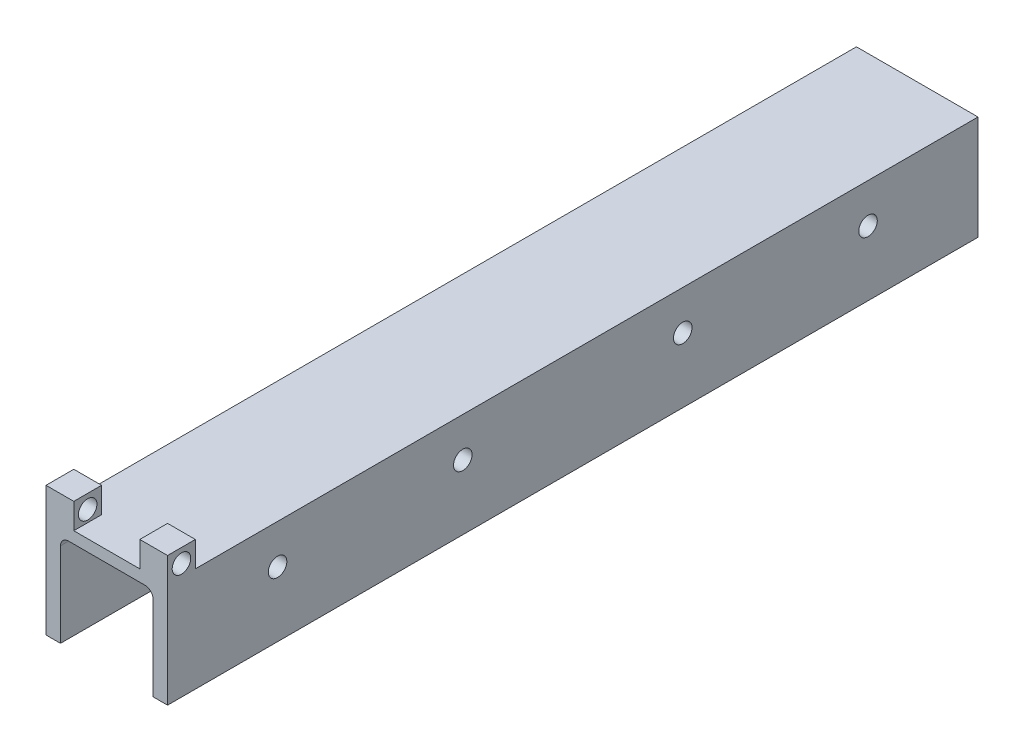
ISO-10303-21;
HEADER;
FILE_DESCRIPTION(('STEP AP214'),'2;1');
FILE_NAME('part.step','',(''),(''),'','','');
FILE_SCHEMA(('AUTOMOTIVE_DESIGN { 1 0 10303 214 1 1 1 1 }'));
ENDSEC;
DATA;
#1=APPLICATION_CONTEXT('core data for automotive mechanical design processes');
#2=APPLICATION_PROTOCOL_DEFINITION('international standard','automotive_design',2000,#1);
#3=PRODUCT_CONTEXT('',#1,'mechanical');
#4=PRODUCT('Part','Part','',(#3));
#5=PRODUCT_RELATED_PRODUCT_CATEGORY('part','',(#4));
#6=PRODUCT_DEFINITION_FORMATION('','',#4);
#7=PRODUCT_DEFINITION_CONTEXT('part definition',#1,'design');
#8=PRODUCT_DEFINITION('design','',#6,#7);
#9=PRODUCT_DEFINITION_SHAPE('','',#8);
#10=(LENGTH_UNIT() NAMED_UNIT(*) SI_UNIT(.MILLI.,.METRE.));
#11=(NAMED_UNIT(*) PLANE_ANGLE_UNIT() SI_UNIT($,.RADIAN.));
#12=(NAMED_UNIT(*) SI_UNIT($,.STERADIAN.) SOLID_ANGLE_UNIT());
#13=UNCERTAINTY_MEASURE_WITH_UNIT(LENGTH_MEASURE(1.E-05),#10,'distance_accuracy_value','');
#14=(GEOMETRIC_REPRESENTATION_CONTEXT(3) GLOBAL_UNCERTAINTY_ASSIGNED_CONTEXT((#13)) GLOBAL_UNIT_ASSIGNED_CONTEXT((#10,
#11,#12)) REPRESENTATION_CONTEXT('',''));
#15=CARTESIAN_POINT('',(0.,0.,0.));
#16=DIRECTION('',(0.,0.,1.));
#17=DIRECTION('',(1.,0.,0.));
#18=AXIS2_PLACEMENT_3D('',#15,#16,#17);
#19=CARTESIAN_POINT('',(0.,0.,-177.8));
#20=DIRECTION('',(0.,-1.,0.));
#21=DIRECTION('',(0.,0.,-1.));
#22=AXIS2_PLACEMENT_3D('',#19,#20,#21);
#23=PLANE('',#22);
#24=DIRECTION('',(1.,0.,0.));
#25=VECTOR('',#24,1.);
#26=CARTESIAN_POINT('',(0.,0.,0.));
#27=LINE('',#26,#25);
#28=CARTESIAN_POINT('',(0.,0.,0.));
#29=VERTEX_POINT('',#28);
#30=CARTESIAN_POINT('',(3.175,0.,0.));
#31=VERTEX_POINT('',#30);
#32=EDGE_CURVE('E277',#29,#31,#27,.T.);
#33=ORIENTED_EDGE('',*,*,#32,.F.);
#34=DIRECTION('',(0.,0.,1.));
#35=VECTOR('',#34,1.);
#36=CARTESIAN_POINT('',(0.,0.,-177.8));
#37=LINE('',#36,#35);
#38=CARTESIAN_POINT('',(0.,0.,-177.8));
#39=VERTEX_POINT('',#38);
#40=EDGE_CURVE('E11',#39,#29,#37,.T.);
#41=ORIENTED_EDGE('',*,*,#40,.F.);
#42=DIRECTION('',(1.,0.,0.));
#43=VECTOR('',#42,1.);
#44=CARTESIAN_POINT('',(0.,0.,-177.8));
#45=LINE('',#44,#43);
#46=CARTESIAN_POINT('',(3.175,0.,-177.8));
#47=VERTEX_POINT('',#46);
#48=EDGE_CURVE('E278',#39,#47,#45,.T.);
#49=ORIENTED_EDGE('',*,*,#48,.T.);
#50=DIRECTION('',(0.,0.,1.));
#51=VECTOR('',#50,1.);
#52=CARTESIAN_POINT('',(3.175,0.,-177.8));
#53=LINE('',#52,#51);
#54=EDGE_CURVE('E317',#47,#31,#53,.T.);
#55=ORIENTED_EDGE('',*,*,#54,.T.);
#56=EDGE_LOOP('',(#33,#41,#49,#55));
#57=FACE_BOUND('',#56,.T.);
#58=ADVANCED_FACE('F47',(#57),#23,.T.);
#59=CARTESIAN_POINT('',(0.,0.,-177.8));
#60=DIRECTION('',(-1.,0.,0.));
#61=DIRECTION('',(0.,0.,1.));
#62=AXIS2_PLACEMENT_3D('',#59,#60,#61);
#63=PLANE('',#62);
#64=CARTESIAN_POINT('',(0.,25.4,-3.048));
#65=DIRECTION('',(-1.,0.,0.));
#66=DIRECTION('',(0.,0.,1.));
#67=AXIS2_PLACEMENT_3D('',#64,#65,#66);
#68=CIRCLE('',#67,2.032);
#69=CARTESIAN_POINT('',(0.,25.4,-1.016));
#70=VERTEX_POINT('',#69);
#71=EDGE_CURVE('E741',#70,#70,#68,.T.);
#72=ORIENTED_EDGE('',*,*,#71,.F.);
#73=EDGE_LOOP('',(#72));
#74=FACE_BOUND('',#73,.T.);
#75=CARTESIAN_POINT('',(0.,14.224,-24.13));
#76=DIRECTION('',(1.,0.,0.));
#77=DIRECTION('',(0.,0.,-1.));
#78=AXIS2_PLACEMENT_3D('',#75,#76,#77);
#79=CIRCLE('',#78,2.032);
#80=CARTESIAN_POINT('',(0.,14.224,-26.162));
#81=VERTEX_POINT('',#80);
#82=EDGE_CURVE('E235',#81,#81,#79,.T.);
#83=ORIENTED_EDGE('',*,*,#82,.T.);
#84=EDGE_LOOP('',(#83));
#85=FACE_BOUND('',#84,.T.);
#86=CARTESIAN_POINT('',(0.,14.224,-64.77));
#87=DIRECTION('',(1.,0.,0.));
#88=DIRECTION('',(0.,0.,-1.));
#89=AXIS2_PLACEMENT_3D('',#86,#87,#88);
#90=CIRCLE('',#89,2.03200000000001);
#91=CARTESIAN_POINT('',(0.,14.224,-66.802));
#92=VERTEX_POINT('',#91);
#93=EDGE_CURVE('E239',#92,#92,#90,.T.);
#94=ORIENTED_EDGE('',*,*,#93,.T.);
#95=EDGE_LOOP('',(#94));
#96=FACE_BOUND('',#95,.T.);
#97=CARTESIAN_POINT('',(0.,14.224,-113.03));
#98=DIRECTION('',(1.,0.,0.));
#99=DIRECTION('',(0.,0.,1.));
#100=AXIS2_PLACEMENT_3D('',#97,#98,#99);
#101=CIRCLE('',#100,2.03200000000001);
#102=CARTESIAN_POINT('',(0.,14.224,-110.998));
#103=VERTEX_POINT('',#102);
#104=EDGE_CURVE('E247',#103,#103,#101,.T.);
#105=ORIENTED_EDGE('',*,*,#104,.T.);
#106=EDGE_LOOP('',(#105));
#107=FACE_BOUND('',#106,.T.);
#108=CARTESIAN_POINT('',(0.,14.224,-153.67));
#109=DIRECTION('',(1.,0.,0.));
#110=DIRECTION('',(0.,0.,1.));
#111=AXIS2_PLACEMENT_3D('',#108,#109,#110);
#112=CIRCLE('',#111,2.03200000000001);
#113=CARTESIAN_POINT('',(0.,14.224,-151.638));
#114=VERTEX_POINT('',#113);
#115=EDGE_CURVE('E191',#114,#114,#112,.T.);
#116=ORIENTED_EDGE('',*,*,#115,.T.);
#117=EDGE_LOOP('',(#116));
#118=FACE_BOUND('',#117,.T.);
#119=DIRECTION('',(0.,-1.,0.));
#120=VECTOR('',#119,1.);
#121=CARTESIAN_POINT('',(0.,0.,0.));
#122=LINE('',#121,#120);
#123=CARTESIAN_POINT('',(0.,28.448,0.));
#124=VERTEX_POINT('',#123);
#125=EDGE_CURVE('E283',#124,#29,#122,.T.);
#126=ORIENTED_EDGE('',*,*,#125,.F.);
#127=DIRECTION('',(0.,0.,1.));
#128=VECTOR('',#127,1.);
#129=CARTESIAN_POINT('',(0.,28.448,0.));
#130=LINE('',#129,#128);
#131=CARTESIAN_POINT('',(0.,28.448,-6.096));
#132=VERTEX_POINT('',#131);
#133=EDGE_CURVE('E215',#132,#124,#130,.T.);
#134=ORIENTED_EDGE('',*,*,#133,.F.);
#135=DIRECTION('',(0.,-1.,0.));
#136=VECTOR('',#135,1.);
#137=CARTESIAN_POINT('',(0.,28.448,-6.096));
#138=LINE('',#137,#136);
#139=CARTESIAN_POINT('',(0.,22.86,-6.09599999999999));
#140=VERTEX_POINT('',#139);
#141=EDGE_CURVE('E206',#132,#140,#138,.T.);
#142=ORIENTED_EDGE('',*,*,#141,.T.);
#143=DIRECTION('',(0.,0.,1.));
#144=VECTOR('',#143,1.);
#145=CARTESIAN_POINT('',(0.,22.86,-177.8));
#146=LINE('',#145,#144);
#147=CARTESIAN_POINT('',(0.,22.86,-177.8));
#148=VERTEX_POINT('',#147);
#149=EDGE_CURVE('E56',#148,#140,#146,.T.);
#150=ORIENTED_EDGE('',*,*,#149,.F.);
#151=DIRECTION('',(0.,-1.,0.));
#152=VECTOR('',#151,1.);
#153=CARTESIAN_POINT('',(0.,0.,-177.8));
#154=LINE('',#153,#152);
#155=EDGE_CURVE('E313',#148,#39,#154,.T.);
#156=ORIENTED_EDGE('',*,*,#155,.T.);
#157=ORIENTED_EDGE('',*,*,#40,.T.);
#158=EDGE_LOOP('',(#126,#134,#142,#150,#156,#157));
#159=FACE_BOUND('',#158,.T.);
#160=ADVANCED_FACE('F403',(#74,#85,#96,#107,#118,#159),#63,.T.);
#161=CARTESIAN_POINT('',(0.,22.86,-177.8));
#162=DIRECTION('',(0.,1.,0.));
#163=DIRECTION('',(0.,0.,1.));
#164=AXIS2_PLACEMENT_3D('',#161,#162,#163);
#165=PLANE('',#164);
#166=DIRECTION('',(0.,0.,1.));
#167=VECTOR('',#166,1.);
#168=CARTESIAN_POINT('',(20.574,22.86,0.));
#169=LINE('',#168,#167);
#170=CARTESIAN_POINT('',(20.574,22.86,-6.096));
#171=VERTEX_POINT('',#170);
#172=CARTESIAN_POINT('',(20.574,22.86,0.));
#173=VERTEX_POINT('',#172);
#174=EDGE_CURVE('E180',#171,#173,#169,.T.);
#175=ORIENTED_EDGE('',*,*,#174,.F.);
#176=DIRECTION('',(-1.,0.,0.));
#177=VECTOR('',#176,1.);
#178=CARTESIAN_POINT('',(26.67,22.86,-6.096));
#179=LINE('',#178,#177);
#180=CARTESIAN_POINT('',(26.67,22.86,-6.09599999999999));
#181=VERTEX_POINT('',#180);
#182=EDGE_CURVE('E70',#181,#171,#179,.T.);
#183=ORIENTED_EDGE('',*,*,#182,.F.);
#184=DIRECTION('',(0.,0.,1.));
#185=VECTOR('',#184,1.);
#186=CARTESIAN_POINT('',(26.67,22.86,-177.8));
#187=LINE('',#186,#185);
#188=CARTESIAN_POINT('',(26.67,22.86,-177.8));
#189=VERTEX_POINT('',#188);
#190=EDGE_CURVE('E184',#189,#181,#187,.T.);
#191=ORIENTED_EDGE('',*,*,#190,.F.);
#192=DIRECTION('',(-1.,0.,0.));
#193=VECTOR('',#192,1.);
#194=CARTESIAN_POINT('',(0.,22.86,-177.8));
#195=LINE('',#194,#193);
#196=EDGE_CURVE('E310',#189,#148,#195,.T.);
#197=ORIENTED_EDGE('',*,*,#196,.T.);
#198=ORIENTED_EDGE('',*,*,#149,.T.);
#199=DIRECTION('',(-1.,0.,0.));
#200=VECTOR('',#199,1.);
#201=CARTESIAN_POINT('',(0.,22.86,-6.096));
#202=LINE('',#201,#200);
#203=CARTESIAN_POINT('',(6.096,22.86,-6.096));
#204=VERTEX_POINT('',#203);
#205=EDGE_CURVE('E211',#204,#140,#202,.T.);
#206=ORIENTED_EDGE('',*,*,#205,.F.);
#207=DIRECTION('',(0.,0.,-1.));
#208=VECTOR('',#207,1.);
#209=CARTESIAN_POINT('',(6.096,22.86,0.));
#210=LINE('',#209,#208);
#211=CARTESIAN_POINT('',(6.096,22.86,0.));
#212=VERTEX_POINT('',#211);
#213=EDGE_CURVE('E214',#212,#204,#210,.T.);
#214=ORIENTED_EDGE('',*,*,#213,.F.);
#215=DIRECTION('',(-1.,0.,0.));
#216=VECTOR('',#215,1.);
#217=CARTESIAN_POINT('',(0.,22.86,0.));
#218=LINE('',#217,#216);
#219=EDGE_CURVE('E348',#173,#212,#218,.T.);
#220=ORIENTED_EDGE('',*,*,#219,.F.);
#221=EDGE_LOOP('',(#175,#183,#191,#197,#198,#206,#214,#220));
#222=FACE_BOUND('',#221,.T.);
#223=ADVANCED_FACE('F406',(#222),#165,.T.);
#224=CARTESIAN_POINT('',(26.67,0.,-177.8));
#225=DIRECTION('',(1.,0.,0.));
#226=DIRECTION('',(0.,0.,-1.));
#227=AXIS2_PLACEMENT_3D('',#224,#225,#226);
#228=PLANE('',#227);
#229=CARTESIAN_POINT('',(26.67,25.4,-3.048));
#230=DIRECTION('',(-1.,0.,0.));
#231=DIRECTION('',(0.,0.,1.));
#232=AXIS2_PLACEMENT_3D('',#229,#230,#231);
#233=CIRCLE('',#232,2.032);
#234=CARTESIAN_POINT('',(26.67,25.4,-1.016));
#235=VERTEX_POINT('',#234);
#236=EDGE_CURVE('E747',#235,#235,#233,.T.);
#237=ORIENTED_EDGE('',*,*,#236,.T.);
#238=EDGE_LOOP('',(#237));
#239=FACE_BOUND('',#238,.T.);
#240=CARTESIAN_POINT('',(26.67,14.224,-24.13));
#241=DIRECTION('',(1.,0.,0.));
#242=DIRECTION('',(0.,0.,-1.));
#243=AXIS2_PLACEMENT_3D('',#240,#241,#242);
#244=CIRCLE('',#243,2.032);
#245=CARTESIAN_POINT('',(26.67,14.224,-26.162));
#246=VERTEX_POINT('',#245);
#247=EDGE_CURVE('E230',#246,#246,#244,.T.);
#248=ORIENTED_EDGE('',*,*,#247,.F.);
#249=EDGE_LOOP('',(#248));
#250=FACE_BOUND('',#249,.T.);
#251=CARTESIAN_POINT('',(26.67,14.224,-64.77));
#252=DIRECTION('',(1.,0.,0.));
#253=DIRECTION('',(0.,0.,-1.));
#254=AXIS2_PLACEMENT_3D('',#251,#252,#253);
#255=CIRCLE('',#254,2.03200000000001);
#256=CARTESIAN_POINT('',(26.67,14.224,-66.802));
#257=VERTEX_POINT('',#256);
#258=EDGE_CURVE('E243',#257,#257,#255,.T.);
#259=ORIENTED_EDGE('',*,*,#258,.F.);
#260=EDGE_LOOP('',(#259));
#261=FACE_BOUND('',#260,.T.);
#262=CARTESIAN_POINT('',(26.67,14.224,-113.03));
#263=DIRECTION('',(1.,0.,0.));
#264=DIRECTION('',(0.,0.,1.));
#265=AXIS2_PLACEMENT_3D('',#262,#263,#264);
#266=CIRCLE('',#265,2.03200000000001);
#267=CARTESIAN_POINT('',(26.67,14.224,-110.998));
#268=VERTEX_POINT('',#267);
#269=EDGE_CURVE('E251',#268,#268,#266,.T.);
#270=ORIENTED_EDGE('',*,*,#269,.F.);
#271=EDGE_LOOP('',(#270));
#272=FACE_BOUND('',#271,.T.);
#273=CARTESIAN_POINT('',(26.67,14.224,-153.67));
#274=DIRECTION('',(1.,0.,0.));
#275=DIRECTION('',(0.,0.,1.));
#276=AXIS2_PLACEMENT_3D('',#273,#274,#275);
#277=CIRCLE('',#276,2.03200000000001);
#278=CARTESIAN_POINT('',(26.67,14.224,-151.638));
#279=VERTEX_POINT('',#278);
#280=EDGE_CURVE('E186',#279,#279,#277,.T.);
#281=ORIENTED_EDGE('',*,*,#280,.F.);
#282=EDGE_LOOP('',(#281));
#283=FACE_BOUND('',#282,.T.);
#284=DIRECTION('',(0.,1.,0.));
#285=VECTOR('',#284,1.);
#286=CARTESIAN_POINT('',(26.67,0.,0.));
#287=LINE('',#286,#285);
#288=CARTESIAN_POINT('',(26.67,0.,0.));
#289=VERTEX_POINT('',#288);
#290=CARTESIAN_POINT('',(26.67,28.448,0.));
#291=VERTEX_POINT('',#290);
#292=EDGE_CURVE('E345',#289,#291,#287,.T.);
#293=ORIENTED_EDGE('',*,*,#292,.F.);
#294=DIRECTION('',(0.,0.,1.));
#295=VECTOR('',#294,1.);
#296=CARTESIAN_POINT('',(26.67,0.,-177.8));
#297=LINE('',#296,#295);
#298=CARTESIAN_POINT('',(26.67,0.,-177.8));
#299=VERTEX_POINT('',#298);
#300=EDGE_CURVE('E359',#299,#289,#297,.T.);
#301=ORIENTED_EDGE('',*,*,#300,.F.);
#302=DIRECTION('',(0.,1.,0.));
#303=VECTOR('',#302,1.);
#304=CARTESIAN_POINT('',(26.67,0.,-177.8));
#305=LINE('',#304,#303);
#306=EDGE_CURVE('E307',#299,#189,#305,.T.);
#307=ORIENTED_EDGE('',*,*,#306,.T.);
#308=ORIENTED_EDGE('',*,*,#190,.T.);
#309=DIRECTION('',(0.,-1.,0.));
#310=VECTOR('',#309,1.);
#311=CARTESIAN_POINT('',(26.67,28.448,-6.096));
#312=LINE('',#311,#310);
#313=CARTESIAN_POINT('',(26.67,28.448,-6.096));
#314=VERTEX_POINT('',#313);
#315=EDGE_CURVE('E163',#314,#181,#312,.T.);
#316=ORIENTED_EDGE('',*,*,#315,.F.);
#317=DIRECTION('',(0.,0.,-1.));
#318=VECTOR('',#317,1.);
#319=CARTESIAN_POINT('',(26.67,28.448,0.));
#320=LINE('',#319,#318);
#321=EDGE_CURVE('E170',#291,#314,#320,.T.);
#322=ORIENTED_EDGE('',*,*,#321,.F.);
#323=EDGE_LOOP('',(#293,#301,#307,#308,#316,#322));
#324=FACE_BOUND('',#323,.T.);
#325=ADVANCED_FACE('F182',(#239,#250,#261,#272,#283,#324),#228,.T.);
#326=CARTESIAN_POINT('',(23.495,0.,-177.8));
#327=DIRECTION('',(0.,-1.,0.));
#328=DIRECTION('',(0.,0.,-1.));
#329=AXIS2_PLACEMENT_3D('',#326,#327,#328);
#330=PLANE('',#329);
#331=DIRECTION('',(1.,0.,0.));
#332=VECTOR('',#331,1.);
#333=CARTESIAN_POINT('',(23.495,0.,0.));
#334=LINE('',#333,#332);
#335=CARTESIAN_POINT('',(23.495,0.,0.));
#336=VERTEX_POINT('',#335);
#337=EDGE_CURVE('E341',#336,#289,#334,.T.);
#338=ORIENTED_EDGE('',*,*,#337,.F.);
#339=DIRECTION('',(0.,0.,1.));
#340=VECTOR('',#339,1.);
#341=CARTESIAN_POINT('',(23.495,0.,-177.8));
#342=LINE('',#341,#340);
#343=CARTESIAN_POINT('',(23.495,0.,-177.8));
#344=VERTEX_POINT('',#343);
#345=EDGE_CURVE('E362',#344,#336,#342,.T.);
#346=ORIENTED_EDGE('',*,*,#345,.F.);
#347=DIRECTION('',(1.,0.,0.));
#348=VECTOR('',#347,1.);
#349=CARTESIAN_POINT('',(23.495,0.,-177.8));
#350=LINE('',#349,#348);
#351=EDGE_CURVE('E303',#344,#299,#350,.T.);
#352=ORIENTED_EDGE('',*,*,#351,.T.);
#353=ORIENTED_EDGE('',*,*,#300,.T.);
#354=EDGE_LOOP('',(#338,#346,#352,#353));
#355=FACE_BOUND('',#354,.T.);
#356=ADVANCED_FACE('F458',(#355),#330,.T.);
#357=CARTESIAN_POINT('',(23.495,18.542,-177.8));
#358=DIRECTION('',(-1.,0.,0.));
#359=DIRECTION('',(0.,0.,1.));
#360=AXIS2_PLACEMENT_3D('',#357,#358,#359);
#361=PLANE('',#360);
#362=CARTESIAN_POINT('',(23.495,14.224,-24.13));
#363=DIRECTION('',(-1.,0.,0.));
#364=DIRECTION('',(0.,0.,1.));
#365=AXIS2_PLACEMENT_3D('',#362,#363,#364);
#366=CIRCLE('',#365,2.032);
#367=CARTESIAN_POINT('',(23.495,14.224,-22.098));
#368=VERTEX_POINT('',#367);
#369=EDGE_CURVE('E273',#368,#368,#366,.F.);
#370=ORIENTED_EDGE('',*,*,#369,.T.);
#371=EDGE_LOOP('',(#370));
#372=FACE_BOUND('',#371,.T.);
#373=CARTESIAN_POINT('',(23.495,14.224,-64.77));
#374=DIRECTION('',(-1.,0.,0.));
#375=DIRECTION('',(0.,0.,1.));
#376=AXIS2_PLACEMENT_3D('',#373,#374,#375);
#377=CIRCLE('',#376,2.03200000000001);
#378=CARTESIAN_POINT('',(23.495,14.224,-62.738));
#379=VERTEX_POINT('',#378);
#380=EDGE_CURVE('E268',#379,#379,#377,.F.);
#381=ORIENTED_EDGE('',*,*,#380,.T.);
#382=EDGE_LOOP('',(#381));
#383=FACE_BOUND('',#382,.T.);
#384=CARTESIAN_POINT('',(23.495,14.224,-113.03));
#385=DIRECTION('',(-1.,0.,0.));
#386=DIRECTION('',(0.,0.,1.));
#387=AXIS2_PLACEMENT_3D('',#384,#385,#386);
#388=CIRCLE('',#387,2.03200000000001);
#389=CARTESIAN_POINT('',(23.495,14.224,-110.998));
#390=VERTEX_POINT('',#389);
#391=EDGE_CURVE('E263',#390,#390,#388,.F.);
#392=ORIENTED_EDGE('',*,*,#391,.T.);
#393=EDGE_LOOP('',(#392));
#394=FACE_BOUND('',#393,.T.);
#395=CARTESIAN_POINT('',(23.495,14.224,-153.67));
#396=DIRECTION('',(-1.,0.,0.));
#397=DIRECTION('',(0.,0.,1.));
#398=AXIS2_PLACEMENT_3D('',#395,#396,#397);
#399=CIRCLE('',#398,2.03200000000001);
#400=CARTESIAN_POINT('',(23.495,14.224,-151.638));
#401=VERTEX_POINT('',#400);
#402=EDGE_CURVE('E258',#401,#401,#399,.F.);
#403=ORIENTED_EDGE('',*,*,#402,.T.);
#404=EDGE_LOOP('',(#403));
#405=FACE_BOUND('',#404,.T.);
#406=DIRECTION('',(0.,-1.,0.));
#407=VECTOR('',#406,1.);
#408=CARTESIAN_POINT('',(23.495,18.542,0.));
#409=LINE('',#408,#407);
#410=CARTESIAN_POINT('',(23.495,18.542,0.));
#411=VERTEX_POINT('',#410);
#412=EDGE_CURVE('E337',#411,#336,#409,.T.);
#413=ORIENTED_EDGE('',*,*,#412,.F.);
#414=DIRECTION('',(0.,0.,1.));
#415=VECTOR('',#414,1.);
#416=CARTESIAN_POINT('',(23.495,18.542,-177.8));
#417=LINE('',#416,#415);
#418=CARTESIAN_POINT('',(23.495,18.542,-177.8));
#419=VERTEX_POINT('',#418);
#420=EDGE_CURVE('E365',#419,#411,#417,.T.);
#421=ORIENTED_EDGE('',*,*,#420,.F.);
#422=DIRECTION('',(0.,-1.,0.));
#423=VECTOR('',#422,1.);
#424=CARTESIAN_POINT('',(23.495,18.542,-177.8));
#425=LINE('',#424,#423);
#426=EDGE_CURVE('E299',#419,#344,#425,.T.);
#427=ORIENTED_EDGE('',*,*,#426,.T.);
#428=ORIENTED_EDGE('',*,*,#345,.T.);
#429=EDGE_LOOP('',(#413,#421,#427,#428));
#430=FACE_BOUND('',#429,.T.);
#431=ADVANCED_FACE('F454',(#372,#383,#394,#405,#430),#361,.T.);
#432=CARTESIAN_POINT('',(21.717,18.542,-177.8));
#433=DIRECTION('',(0.,0.,1.));
#434=DIRECTION('',(1.,0.,0.));
#435=AXIS2_PLACEMENT_3D('',#432,#433,#434);
#436=CYLINDRICAL_SURFACE('',#435,1.778);
#437=CARTESIAN_POINT('',(21.717,18.542,0.));
#438=DIRECTION('',(0.,0.,-1.));
#439=DIRECTION('',(1.,0.,0.));
#440=AXIS2_PLACEMENT_3D('',#437,#438,#439);
#441=CIRCLE('',#440,1.778);
#442=CARTESIAN_POINT('',(21.717,20.32,0.));
#443=VERTEX_POINT('',#442);
#444=EDGE_CURVE('E333',#443,#411,#441,.T.);
#445=ORIENTED_EDGE('',*,*,#444,.F.);
#446=DIRECTION('',(0.,0.,1.));
#447=VECTOR('',#446,1.);
#448=CARTESIAN_POINT('',(21.717,20.32,-177.8));
#449=LINE('',#448,#447);
#450=CARTESIAN_POINT('',(21.717,20.32,-177.8));
#451=VERTEX_POINT('',#450);
#452=EDGE_CURVE('E368',#451,#443,#449,.T.);
#453=ORIENTED_EDGE('',*,*,#452,.F.);
#454=CARTESIAN_POINT('',(21.717,18.542,-177.8));
#455=DIRECTION('',(0.,0.,-1.));
#456=DIRECTION('',(1.,0.,0.));
#457=AXIS2_PLACEMENT_3D('',#454,#455,#456);
#458=CIRCLE('',#457,1.778);
#459=EDGE_CURVE('E295',#451,#419,#458,.T.);
#460=ORIENTED_EDGE('',*,*,#459,.T.);
#461=ORIENTED_EDGE('',*,*,#420,.T.);
#462=EDGE_LOOP('',(#445,#453,#460,#461));
#463=FACE_BOUND('',#462,.T.);
#464=ADVANCED_FACE('F450',(#463),#436,.F.);
#465=CARTESIAN_POINT('',(4.95300000000001,20.32,-177.8));
#466=DIRECTION('',(0.,-1.,0.));
#467=DIRECTION('',(0.,0.,-1.));
#468=AXIS2_PLACEMENT_3D('',#465,#466,#467);
#469=PLANE('',#468);
#470=DIRECTION('',(1.,0.,0.));
#471=VECTOR('',#470,1.);
#472=CARTESIAN_POINT('',(4.95300000000001,20.32,0.));
#473=LINE('',#472,#471);
#474=CARTESIAN_POINT('',(4.95300000000001,20.32,0.));
#475=VERTEX_POINT('',#474);
#476=EDGE_CURVE('E329',#475,#443,#473,.T.);
#477=ORIENTED_EDGE('',*,*,#476,.F.);
#478=DIRECTION('',(0.,0.,1.));
#479=VECTOR('',#478,1.);
#480=CARTESIAN_POINT('',(4.95300000000001,20.32,-177.8));
#481=LINE('',#480,#479);
#482=CARTESIAN_POINT('',(4.95300000000001,20.32,-177.8));
#483=VERTEX_POINT('',#482);
#484=EDGE_CURVE('E371',#483,#475,#481,.T.);
#485=ORIENTED_EDGE('',*,*,#484,.F.);
#486=DIRECTION('',(1.,0.,0.));
#487=VECTOR('',#486,1.);
#488=CARTESIAN_POINT('',(4.95300000000001,20.32,-177.8));
#489=LINE('',#488,#487);
#490=EDGE_CURVE('E291',#483,#451,#489,.T.);
#491=ORIENTED_EDGE('',*,*,#490,.T.);
#492=ORIENTED_EDGE('',*,*,#452,.T.);
#493=EDGE_LOOP('',(#477,#485,#491,#492));
#494=FACE_BOUND('',#493,.T.);
#495=ADVANCED_FACE('F446',(#494),#469,.T.);
#496=CARTESIAN_POINT('',(4.953,18.542,-177.8));
#497=DIRECTION('',(0.,0.,1.));
#498=DIRECTION('',(1.,0.,0.));
#499=AXIS2_PLACEMENT_3D('',#496,#497,#498);
#500=CYLINDRICAL_SURFACE('',#499,1.778);
#501=CARTESIAN_POINT('',(4.953,18.542,0.));
#502=DIRECTION('',(0.,0.,-1.));
#503=DIRECTION('',(-1.,0.,0.));
#504=AXIS2_PLACEMENT_3D('',#501,#502,#503);
#505=CIRCLE('',#504,1.778);
#506=CARTESIAN_POINT('',(3.175,18.542,0.));
#507=VERTEX_POINT('',#506);
#508=EDGE_CURVE('E325',#507,#475,#505,.T.);
#509=ORIENTED_EDGE('',*,*,#508,.F.);
#510=DIRECTION('',(0.,0.,1.));
#511=VECTOR('',#510,1.);
#512=CARTESIAN_POINT('',(3.175,18.542,-177.8));
#513=LINE('',#512,#511);
#514=CARTESIAN_POINT('',(3.175,18.542,-177.8));
#515=VERTEX_POINT('',#514);
#516=EDGE_CURVE('E374',#515,#507,#513,.T.);
#517=ORIENTED_EDGE('',*,*,#516,.F.);
#518=CARTESIAN_POINT('',(4.953,18.542,-177.8));
#519=DIRECTION('',(0.,0.,-1.));
#520=DIRECTION('',(-1.,0.,0.));
#521=AXIS2_PLACEMENT_3D('',#518,#519,#520);
#522=CIRCLE('',#521,1.778);
#523=EDGE_CURVE('E287',#515,#483,#522,.T.);
#524=ORIENTED_EDGE('',*,*,#523,.T.);
#525=ORIENTED_EDGE('',*,*,#484,.T.);
#526=EDGE_LOOP('',(#509,#517,#524,#525));
#527=FACE_BOUND('',#526,.T.);
#528=ADVANCED_FACE('F442',(#527),#500,.F.);
#529=CARTESIAN_POINT('',(3.175,0.,-177.8));
#530=DIRECTION('',(1.,0.,0.));
#531=DIRECTION('',(0.,0.,-1.));
#532=AXIS2_PLACEMENT_3D('',#529,#530,#531);
#533=PLANE('',#532);
#534=CARTESIAN_POINT('',(3.175,14.224,-24.13));
#535=DIRECTION('',(1.,0.,0.));
#536=DIRECTION('',(0.,0.,-1.));
#537=AXIS2_PLACEMENT_3D('',#534,#535,#536);
#538=CIRCLE('',#537,2.032);
#539=CARTESIAN_POINT('',(3.175,14.224,-26.162));
#540=VERTEX_POINT('',#539);
#541=EDGE_CURVE('E272',#540,#540,#538,.F.);
#542=ORIENTED_EDGE('',*,*,#541,.T.);
#543=EDGE_LOOP('',(#542));
#544=FACE_BOUND('',#543,.T.);
#545=CARTESIAN_POINT('',(3.175,14.224,-64.77));
#546=DIRECTION('',(1.,0.,0.));
#547=DIRECTION('',(0.,0.,-1.));
#548=AXIS2_PLACEMENT_3D('',#545,#546,#547);
#549=CIRCLE('',#548,2.03200000000001);
#550=CARTESIAN_POINT('',(3.175,14.224,-66.802));
#551=VERTEX_POINT('',#550);
#552=EDGE_CURVE('E267',#551,#551,#549,.F.);
#553=ORIENTED_EDGE('',*,*,#552,.T.);
#554=EDGE_LOOP('',(#553));
#555=FACE_BOUND('',#554,.T.);
#556=CARTESIAN_POINT('',(3.175,14.224,-113.03));
#557=DIRECTION('',(1.,0.,0.));
#558=DIRECTION('',(0.,0.,-1.));
#559=AXIS2_PLACEMENT_3D('',#556,#557,#558);
#560=CIRCLE('',#559,2.03200000000001);
#561=CARTESIAN_POINT('',(3.175,14.224,-115.062));
#562=VERTEX_POINT('',#561);
#563=EDGE_CURVE('E262',#562,#562,#560,.F.);
#564=ORIENTED_EDGE('',*,*,#563,.T.);
#565=EDGE_LOOP('',(#564));
#566=FACE_BOUND('',#565,.T.);
#567=CARTESIAN_POINT('',(3.175,14.224,-153.67));
#568=DIRECTION('',(1.,0.,0.));
#569=DIRECTION('',(0.,0.,-1.));
#570=AXIS2_PLACEMENT_3D('',#567,#568,#569);
#571=CIRCLE('',#570,2.03200000000001);
#572=CARTESIAN_POINT('',(3.175,14.224,-155.702));
#573=VERTEX_POINT('',#572);
#574=EDGE_CURVE('E234',#573,#573,#571,.F.);
#575=ORIENTED_EDGE('',*,*,#574,.T.);
#576=EDGE_LOOP('',(#575));
#577=FACE_BOUND('',#576,.T.);
#578=DIRECTION('',(0.,1.,0.));
#579=VECTOR('',#578,1.);
#580=CARTESIAN_POINT('',(3.175,0.,0.));
#581=LINE('',#580,#579);
#582=EDGE_CURVE('E321',#31,#507,#581,.T.);
#583=ORIENTED_EDGE('',*,*,#582,.F.);
#584=ORIENTED_EDGE('',*,*,#54,.F.);
#585=DIRECTION('',(0.,1.,0.));
#586=VECTOR('',#585,1.);
#587=CARTESIAN_POINT('',(3.175,0.,-177.8));
#588=LINE('',#587,#586);
#589=EDGE_CURVE('E282',#47,#515,#588,.T.);
#590=ORIENTED_EDGE('',*,*,#589,.T.);
#591=ORIENTED_EDGE('',*,*,#516,.T.);
#592=EDGE_LOOP('',(#583,#584,#590,#591));
#593=FACE_BOUND('',#592,.T.);
#594=ADVANCED_FACE('F391',(#544,#555,#566,#577,#593),#533,.T.);
#595=CARTESIAN_POINT('',(4.953,18.542,-177.8));
#596=DIRECTION('',(0.,0.,-1.));
#597=DIRECTION('',(-1.,0.,0.));
#598=AXIS2_PLACEMENT_3D('',#595,#596,#597);
#599=PLANE('',#598);
#600=ORIENTED_EDGE('',*,*,#48,.F.);
#601=ORIENTED_EDGE('',*,*,#155,.F.);
#602=ORIENTED_EDGE('',*,*,#196,.F.);
#603=ORIENTED_EDGE('',*,*,#306,.F.);
#604=ORIENTED_EDGE('',*,*,#351,.F.);
#605=ORIENTED_EDGE('',*,*,#426,.F.);
#606=ORIENTED_EDGE('',*,*,#459,.F.);
#607=ORIENTED_EDGE('',*,*,#490,.F.);
#608=ORIENTED_EDGE('',*,*,#523,.F.);
#609=ORIENTED_EDGE('',*,*,#589,.F.);
#610=EDGE_LOOP('',(#600,#601,#602,#603,#604,#605,#606,#607,#608,#609));
#611=FACE_BOUND('',#610,.T.);
#612=ADVANCED_FACE('F434',(#611),#599,.T.);
#613=CARTESIAN_POINT('',(4.953,18.542,0.));
#614=DIRECTION('',(0.,0.,-1.));
#615=DIRECTION('',(-1.,0.,0.));
#616=AXIS2_PLACEMENT_3D('',#613,#614,#615);
#617=PLANE('',#616);
#618=ORIENTED_EDGE('',*,*,#32,.T.);
#619=ORIENTED_EDGE('',*,*,#582,.T.);
#620=ORIENTED_EDGE('',*,*,#508,.T.);
#621=ORIENTED_EDGE('',*,*,#476,.T.);
#622=ORIENTED_EDGE('',*,*,#444,.T.);
#623=ORIENTED_EDGE('',*,*,#412,.T.);
#624=ORIENTED_EDGE('',*,*,#337,.T.);
#625=ORIENTED_EDGE('',*,*,#292,.T.);
#626=DIRECTION('',(1.,0.,0.));
#627=VECTOR('',#626,1.);
#628=CARTESIAN_POINT('',(26.67,28.448,0.));
#629=LINE('',#628,#627);
#630=CARTESIAN_POINT('',(20.574,28.448,0.));
#631=VERTEX_POINT('',#630);
#632=EDGE_CURVE('E176',#631,#291,#629,.T.);
#633=ORIENTED_EDGE('',*,*,#632,.F.);
#634=DIRECTION('',(0.,-1.,0.));
#635=VECTOR('',#634,1.);
#636=CARTESIAN_POINT('',(20.574,28.448,0.));
#637=LINE('',#636,#635);
#638=EDGE_CURVE('E193',#631,#173,#637,.T.);
#639=ORIENTED_EDGE('',*,*,#638,.T.);
#640=ORIENTED_EDGE('',*,*,#219,.T.);
#641=DIRECTION('',(0.,-1.,0.));
#642=VECTOR('',#641,1.);
#643=CARTESIAN_POINT('',(6.096,28.448,0.));
#644=LINE('',#643,#642);
#645=CARTESIAN_POINT('',(6.096,28.448,0.));
#646=VERTEX_POINT('',#645);
#647=EDGE_CURVE('E197',#646,#212,#644,.T.);
#648=ORIENTED_EDGE('',*,*,#647,.F.);
#649=DIRECTION('',(1.,0.,0.));
#650=VECTOR('',#649,1.);
#651=CARTESIAN_POINT('',(0.,28.448,0.));
#652=LINE('',#651,#650);
#653=EDGE_CURVE('E224',#124,#646,#652,.T.);
#654=ORIENTED_EDGE('',*,*,#653,.F.);
#655=ORIENTED_EDGE('',*,*,#125,.T.);
#656=EDGE_LOOP('',(#618,#619,#620,#621,#622,#623,#624,#625,#633,#639,#640,#648,#654,#655));
#657=FACE_BOUND('',#656,.T.);
#658=ADVANCED_FACE('F420',(#657),#617,.F.);
#659=CARTESIAN_POINT('',(26.67,14.224,-153.67));
#660=DIRECTION('',(-1.,0.,0.));
#661=DIRECTION('',(0.,0.,1.));
#662=AXIS2_PLACEMENT_3D('',#659,#660,#661);
#663=CYLINDRICAL_SURFACE('',#662,2.03200000000001);
#664=ORIENTED_EDGE('',*,*,#574,.F.);
#665=EDGE_LOOP('',(#664));
#666=FACE_BOUND('',#665,.T.);
#667=ORIENTED_EDGE('',*,*,#115,.F.);
#668=EDGE_LOOP('',(#667));
#669=FACE_BOUND('',#668,.T.);
#670=ADVANCED_FACE('F554',(#666,#669),#663,.F.);
#671=CARTESIAN_POINT('',(26.67,14.224,-113.03));
#672=DIRECTION('',(-1.,0.,0.));
#673=DIRECTION('',(0.,0.,1.));
#674=AXIS2_PLACEMENT_3D('',#671,#672,#673);
#675=CYLINDRICAL_SURFACE('',#674,2.03200000000001);
#676=ORIENTED_EDGE('',*,*,#563,.F.);
#677=EDGE_LOOP('',(#676));
#678=FACE_BOUND('',#677,.T.);
#679=ORIENTED_EDGE('',*,*,#104,.F.);
#680=EDGE_LOOP('',(#679));
#681=FACE_BOUND('',#680,.T.);
#682=ADVANCED_FACE('F558',(#678,#681),#675,.F.);
#683=CARTESIAN_POINT('',(26.67,14.224,-64.77));
#684=DIRECTION('',(-1.,0.,0.));
#685=DIRECTION('',(0.,0.,1.));
#686=AXIS2_PLACEMENT_3D('',#683,#684,#685);
#687=CYLINDRICAL_SURFACE('',#686,2.03200000000001);
#688=ORIENTED_EDGE('',*,*,#552,.F.);
#689=EDGE_LOOP('',(#688));
#690=FACE_BOUND('',#689,.T.);
#691=ORIENTED_EDGE('',*,*,#93,.F.);
#692=EDGE_LOOP('',(#691));
#693=FACE_BOUND('',#692,.T.);
#694=ADVANCED_FACE('F398',(#690,#693),#687,.F.);
#695=CARTESIAN_POINT('',(26.67,14.224,-24.13));
#696=DIRECTION('',(-1.,0.,0.));
#697=DIRECTION('',(0.,0.,1.));
#698=AXIS2_PLACEMENT_3D('',#695,#696,#697);
#699=CYLINDRICAL_SURFACE('',#698,2.032);
#700=ORIENTED_EDGE('',*,*,#541,.F.);
#701=EDGE_LOOP('',(#700));
#702=FACE_BOUND('',#701,.T.);
#703=ORIENTED_EDGE('',*,*,#82,.F.);
#704=EDGE_LOOP('',(#703));
#705=FACE_BOUND('',#704,.T.);
#706=ADVANCED_FACE('F394',(#702,#705),#699,.F.);
#707=ORIENTED_EDGE('',*,*,#402,.F.);
#708=EDGE_LOOP('',(#707));
#709=FACE_BOUND('',#708,.T.);
#710=ORIENTED_EDGE('',*,*,#280,.T.);
#711=EDGE_LOOP('',(#710));
#712=FACE_BOUND('',#711,.T.);
#713=ADVANCED_FACE('F397',(#709,#712),#663,.F.);
#714=ORIENTED_EDGE('',*,*,#391,.F.);
#715=EDGE_LOOP('',(#714));
#716=FACE_BOUND('',#715,.T.);
#717=ORIENTED_EDGE('',*,*,#269,.T.);
#718=EDGE_LOOP('',(#717));
#719=FACE_BOUND('',#718,.T.);
#720=ADVANCED_FACE('F569',(#716,#719),#675,.F.);
#721=ORIENTED_EDGE('',*,*,#380,.F.);
#722=EDGE_LOOP('',(#721));
#723=FACE_BOUND('',#722,.T.);
#724=ORIENTED_EDGE('',*,*,#258,.T.);
#725=EDGE_LOOP('',(#724));
#726=FACE_BOUND('',#725,.T.);
#727=ADVANCED_FACE('F485',(#723,#726),#687,.F.);
#728=ORIENTED_EDGE('',*,*,#369,.F.);
#729=EDGE_LOOP('',(#728));
#730=FACE_BOUND('',#729,.T.);
#731=ORIENTED_EDGE('',*,*,#247,.T.);
#732=EDGE_LOOP('',(#731));
#733=FACE_BOUND('',#732,.T.);
#734=ADVANCED_FACE('F400',(#730,#733),#699,.F.);
#735=CARTESIAN_POINT('',(6.096,28.448,0.));
#736=DIRECTION('',(-1.,0.,0.));
#737=DIRECTION('',(0.,0.,1.));
#738=AXIS2_PLACEMENT_3D('',#735,#736,#737);
#739=PLANE('',#738);
#740=CARTESIAN_POINT('',(6.096,25.4,-3.048));
#741=DIRECTION('',(-1.,0.,0.));
#742=DIRECTION('',(0.,0.,1.));
#743=AXIS2_PLACEMENT_3D('',#740,#741,#742);
#744=CIRCLE('',#743,2.032);
#745=CARTESIAN_POINT('',(6.096,25.4,-1.016));
#746=VERTEX_POINT('',#745);
#747=EDGE_CURVE('E202',#746,#746,#744,.T.);
#748=ORIENTED_EDGE('',*,*,#747,.T.);
#749=EDGE_LOOP('',(#748));
#750=FACE_BOUND('',#749,.T.);
#751=ORIENTED_EDGE('',*,*,#213,.T.);
#752=DIRECTION('',(0.,-1.,0.));
#753=VECTOR('',#752,1.);
#754=CARTESIAN_POINT('',(6.096,28.448,-6.096));
#755=LINE('',#754,#753);
#756=CARTESIAN_POINT('',(6.096,28.448,-6.096));
#757=VERTEX_POINT('',#756);
#758=EDGE_CURVE('E201',#757,#204,#755,.T.);
#759=ORIENTED_EDGE('',*,*,#758,.F.);
#760=DIRECTION('',(0.,0.,-1.));
#761=VECTOR('',#760,1.);
#762=CARTESIAN_POINT('',(6.096,28.448,0.));
#763=LINE('',#762,#761);
#764=EDGE_CURVE('E221',#646,#757,#763,.T.);
#765=ORIENTED_EDGE('',*,*,#764,.F.);
#766=ORIENTED_EDGE('',*,*,#647,.T.);
#767=EDGE_LOOP('',(#751,#759,#765,#766));
#768=FACE_BOUND('',#767,.T.);
#769=ADVANCED_FACE('F474',(#750,#768),#739,.F.);
#770=CARTESIAN_POINT('',(0.,28.448,-6.096));
#771=DIRECTION('',(0.,0.,1.));
#772=DIRECTION('',(1.,0.,0.));
#773=AXIS2_PLACEMENT_3D('',#770,#771,#772);
#774=PLANE('',#773);
#775=ORIENTED_EDGE('',*,*,#205,.T.);
#776=ORIENTED_EDGE('',*,*,#141,.F.);
#777=DIRECTION('',(-1.,0.,0.));
#778=VECTOR('',#777,1.);
#779=CARTESIAN_POINT('',(0.,28.448,-6.096));
#780=LINE('',#779,#778);
#781=EDGE_CURVE('E210',#757,#132,#780,.T.);
#782=ORIENTED_EDGE('',*,*,#781,.F.);
#783=ORIENTED_EDGE('',*,*,#758,.T.);
#784=EDGE_LOOP('',(#775,#776,#782,#783));
#785=FACE_BOUND('',#784,.T.);
#786=ADVANCED_FACE('F428',(#785),#774,.F.);
#787=CARTESIAN_POINT('',(0.,28.448,0.));
#788=DIRECTION('',(0.,-1.,0.));
#789=DIRECTION('',(0.,0.,-1.));
#790=AXIS2_PLACEMENT_3D('',#787,#788,#789);
#791=PLANE('',#790);
#792=ORIENTED_EDGE('',*,*,#133,.T.);
#793=ORIENTED_EDGE('',*,*,#653,.T.);
#794=ORIENTED_EDGE('',*,*,#764,.T.);
#795=ORIENTED_EDGE('',*,*,#781,.T.);
#796=EDGE_LOOP('',(#792,#793,#794,#795));
#797=FACE_BOUND('',#796,.T.);
#798=ADVANCED_FACE('F423',(#797),#791,.F.);
#799=CARTESIAN_POINT('',(26.67,28.448,-6.096));
#800=DIRECTION('',(0.,0.,1.));
#801=DIRECTION('',(1.,0.,0.));
#802=AXIS2_PLACEMENT_3D('',#799,#800,#801);
#803=PLANE('',#802);
#804=ORIENTED_EDGE('',*,*,#182,.T.);
#805=DIRECTION('',(0.,-1.,0.));
#806=VECTOR('',#805,1.);
#807=CARTESIAN_POINT('',(20.574,28.448,-6.096));
#808=LINE('',#807,#806);
#809=CARTESIAN_POINT('',(20.574,28.448,-6.096));
#810=VERTEX_POINT('',#809);
#811=EDGE_CURVE('E165',#810,#171,#808,.T.);
#812=ORIENTED_EDGE('',*,*,#811,.F.);
#813=DIRECTION('',(-1.,0.,0.));
#814=VECTOR('',#813,1.);
#815=CARTESIAN_POINT('',(26.67,28.448,-6.096));
#816=LINE('',#815,#814);
#817=EDGE_CURVE('E159',#314,#810,#816,.T.);
#818=ORIENTED_EDGE('',*,*,#817,.F.);
#819=ORIENTED_EDGE('',*,*,#315,.T.);
#820=EDGE_LOOP('',(#804,#812,#818,#819));
#821=FACE_BOUND('',#820,.T.);
#822=ADVANCED_FACE('F161',(#821),#803,.F.);
#823=CARTESIAN_POINT('',(20.574,28.448,0.));
#824=DIRECTION('',(1.,0.,0.));
#825=DIRECTION('',(0.,0.,-1.));
#826=AXIS2_PLACEMENT_3D('',#823,#824,#825);
#827=PLANE('',#826);
#828=CARTESIAN_POINT('',(20.574,25.4,-3.048));
#829=DIRECTION('',(1.,0.,0.));
#830=DIRECTION('',(0.,0.,-1.));
#831=AXIS2_PLACEMENT_3D('',#828,#829,#830);
#832=CIRCLE('',#831,2.032);
#833=CARTESIAN_POINT('',(20.574,25.4,-5.08));
#834=VERTEX_POINT('',#833);
#835=EDGE_CURVE('E50',#834,#834,#832,.T.);
#836=ORIENTED_EDGE('',*,*,#835,.T.);
#837=EDGE_LOOP('',(#836));
#838=FACE_BOUND('',#837,.T.);
#839=ORIENTED_EDGE('',*,*,#174,.T.);
#840=ORIENTED_EDGE('',*,*,#638,.F.);
#841=DIRECTION('',(0.,0.,1.));
#842=VECTOR('',#841,1.);
#843=CARTESIAN_POINT('',(20.574,28.448,0.));
#844=LINE('',#843,#842);
#845=EDGE_CURVE('E169',#810,#631,#844,.T.);
#846=ORIENTED_EDGE('',*,*,#845,.F.);
#847=ORIENTED_EDGE('',*,*,#811,.T.);
#848=EDGE_LOOP('',(#839,#840,#846,#847));
#849=FACE_BOUND('',#848,.T.);
#850=ADVANCED_FACE('F472',(#838,#849),#827,.F.);
#851=CARTESIAN_POINT('',(0.,28.448,0.));
#852=DIRECTION('',(0.,1.,0.));
#853=DIRECTION('',(0.,0.,1.));
#854=AXIS2_PLACEMENT_3D('',#851,#852,#853);
#855=PLANE('',#854);
#856=ORIENTED_EDGE('',*,*,#321,.T.);
#857=ORIENTED_EDGE('',*,*,#817,.T.);
#858=ORIENTED_EDGE('',*,*,#845,.T.);
#859=ORIENTED_EDGE('',*,*,#632,.T.);
#860=EDGE_LOOP('',(#856,#857,#858,#859));
#861=FACE_BOUND('',#860,.T.);
#862=ADVANCED_FACE('F174',(#861),#855,.T.);
#863=CARTESIAN_POINT('',(26.67,25.4,-3.048));
#864=DIRECTION('',(-1.,0.,0.));
#865=DIRECTION('',(0.,0.,1.));
#866=AXIS2_PLACEMENT_3D('',#863,#864,#865);
#867=CYLINDRICAL_SURFACE('',#866,2.032);
#868=ORIENTED_EDGE('',*,*,#236,.F.);
#869=EDGE_LOOP('',(#868));
#870=FACE_BOUND('',#869,.T.);
#871=ORIENTED_EDGE('',*,*,#835,.F.);
#872=EDGE_LOOP('',(#871));
#873=FACE_BOUND('',#872,.T.);
#874=ADVANCED_FACE('F653',(#870,#873),#867,.F.);
#875=ORIENTED_EDGE('',*,*,#71,.T.);
#876=EDGE_LOOP('',(#875));
#877=FACE_BOUND('',#876,.T.);
#878=ORIENTED_EDGE('',*,*,#747,.F.);
#879=EDGE_LOOP('',(#878));
#880=FACE_BOUND('',#879,.T.);
#881=ADVANCED_FACE('F724',(#877,#880),#867,.F.);
#882=CLOSED_SHELL('',(#58,#160,#223,#325,#356,#431,#464,#495,#528,#594,#612,#658,#670,#682,#694,
#706,#713,#720,#727,#734,#769,#786,#798,#822,#850,#862,#874,#881));
#883=MANIFOLD_SOLID_BREP('B2',#882);
#884=ADVANCED_BREP_SHAPE_REPRESENTATION('',(#18,#883),#14);
#885=SHAPE_DEFINITION_REPRESENTATION(#9,#884);
ENDSEC;
END-ISO-10303-21;
